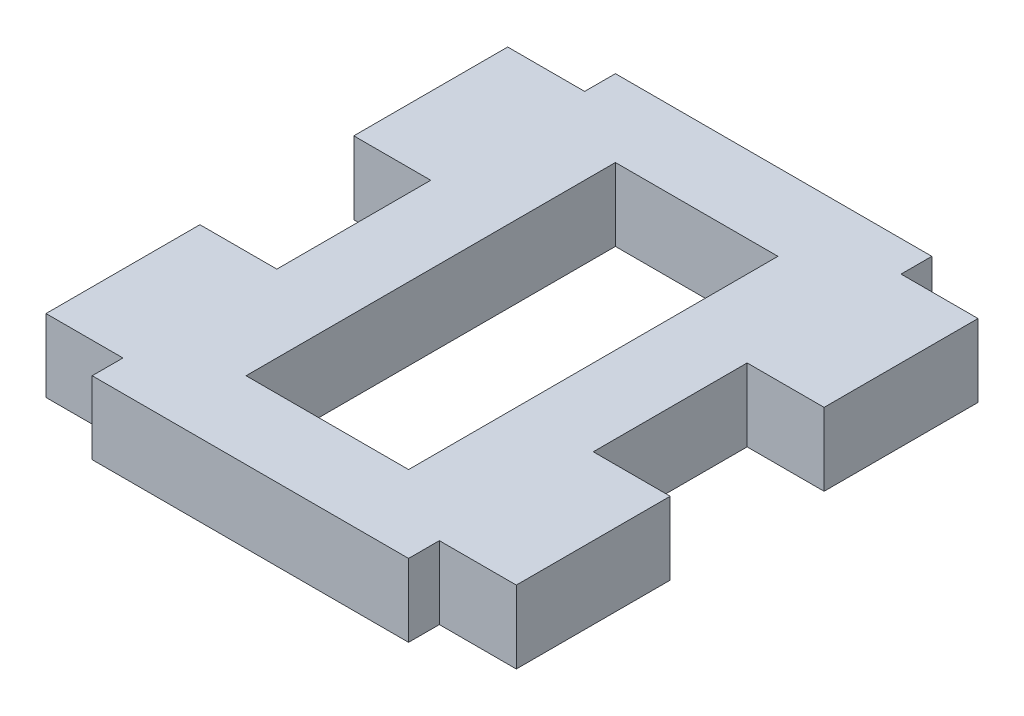
ISO-10303-21;
HEADER;
FILE_DESCRIPTION(('STEP AP214'),'2;1');
FILE_NAME('part.step','',(''),(''),'','','');
FILE_SCHEMA(('AUTOMOTIVE_DESIGN { 1 0 10303 214 1 1 1 1 }'));
ENDSEC;
DATA;
#1=APPLICATION_CONTEXT('core data for automotive mechanical design processes');
#2=APPLICATION_PROTOCOL_DEFINITION('international standard','automotive_design',2000,#1);
#3=PRODUCT_CONTEXT('',#1,'mechanical');
#4=PRODUCT('Part','Part','',(#3));
#5=PRODUCT_RELATED_PRODUCT_CATEGORY('part','',(#4));
#6=PRODUCT_DEFINITION_FORMATION('','',#4);
#7=PRODUCT_DEFINITION_CONTEXT('part definition',#1,'design');
#8=PRODUCT_DEFINITION('design','',#6,#7);
#9=PRODUCT_DEFINITION_SHAPE('','',#8);
#10=(LENGTH_UNIT() NAMED_UNIT(*) SI_UNIT(.MILLI.,.METRE.));
#11=(NAMED_UNIT(*) PLANE_ANGLE_UNIT() SI_UNIT($,.RADIAN.));
#12=(NAMED_UNIT(*) SI_UNIT($,.STERADIAN.) SOLID_ANGLE_UNIT());
#13=UNCERTAINTY_MEASURE_WITH_UNIT(LENGTH_MEASURE(1.E-05),#10,'distance_accuracy_value','');
#14=(GEOMETRIC_REPRESENTATION_CONTEXT(3) GLOBAL_UNCERTAINTY_ASSIGNED_CONTEXT((#13)) GLOBAL_UNIT_ASSIGNED_CONTEXT((#10,
#11,#12)) REPRESENTATION_CONTEXT('',''));
#15=CARTESIAN_POINT('',(0.,0.,0.));
#16=DIRECTION('',(0.,0.,1.));
#17=DIRECTION('',(1.,0.,0.));
#18=AXIS2_PLACEMENT_3D('',#15,#16,#17);
#19=CARTESIAN_POINT('',(13.0556,6.,21.59));
#20=DIRECTION('',(-1.,0.,0.));
#21=DIRECTION('',(0.,0.,1.));
#22=AXIS2_PLACEMENT_3D('',#19,#20,#21);
#23=PLANE('',#22);
#24=DIRECTION('',(0.,-1.,0.));
#25=VECTOR('',#24,1.);
#26=CARTESIAN_POINT('',(13.0556,20.1990316571237,-6.35));
#27=LINE('',#26,#25);
#28=CARTESIAN_POINT('',(13.0556,6.,-6.35));
#29=VERTEX_POINT('',#28);
#30=CARTESIAN_POINT('',(13.0556,0.,-6.35));
#31=VERTEX_POINT('',#30);
#32=EDGE_CURVE('E276',#29,#31,#27,.T.);
#33=ORIENTED_EDGE('',*,*,#32,.F.);
#34=DIRECTION('',(0.,0.,-1.));
#35=VECTOR('',#34,1.);
#36=CARTESIAN_POINT('',(13.0556,6.,21.59));
#37=LINE('',#36,#35);
#38=CARTESIAN_POINT('',(13.0556,6.,6.35));
#39=VERTEX_POINT('',#38);
#40=EDGE_CURVE('E341',#39,#29,#37,.T.);
#41=ORIENTED_EDGE('',*,*,#40,.F.);
#42=DIRECTION('',(0.,-1.,0.));
#43=VECTOR('',#42,1.);
#44=CARTESIAN_POINT('',(13.0556,20.1990316571237,6.35));
#45=LINE('',#44,#43);
#46=CARTESIAN_POINT('',(13.0556,0.,6.35));
#47=VERTEX_POINT('',#46);
#48=EDGE_CURVE('E249',#39,#47,#45,.T.);
#49=ORIENTED_EDGE('',*,*,#48,.T.);
#50=DIRECTION('',(0.,0.,-1.));
#51=VECTOR('',#50,1.);
#52=CARTESIAN_POINT('',(13.0556,0.,21.59));
#53=LINE('',#52,#51);
#54=EDGE_CURVE('E355',#47,#31,#53,.T.);
#55=ORIENTED_EDGE('',*,*,#54,.T.);
#56=EDGE_LOOP('',(#33,#41,#49,#55));
#57=FACE_BOUND('',#56,.T.);
#58=ADVANCED_FACE('F39',(#57),#23,.F.);
#59=DIRECTION('',(0.,-1.,0.));
#60=VECTOR('',#59,1.);
#61=CARTESIAN_POINT('',(13.0556,20.1990316571237,19.05));
#62=LINE('',#61,#60);
#63=CARTESIAN_POINT('',(13.0556,6.,19.05));
#64=VERTEX_POINT('',#63);
#65=CARTESIAN_POINT('',(13.0556,0.,19.05));
#66=VERTEX_POINT('',#65);
#67=EDGE_CURVE('E246',#64,#66,#62,.T.);
#68=ORIENTED_EDGE('',*,*,#67,.F.);
#69=CARTESIAN_POINT('',(13.0556,6.,21.59));
#70=VERTEX_POINT('',#69);
#71=EDGE_CURVE('E337',#70,#64,#37,.T.);
#72=ORIENTED_EDGE('',*,*,#71,.F.);
#73=DIRECTION('',(0.,-1.,0.));
#74=VECTOR('',#73,1.);
#75=CARTESIAN_POINT('',(13.0556,6.,21.59));
#76=LINE('',#75,#74);
#77=CARTESIAN_POINT('',(13.0556,0.,21.59));
#78=VERTEX_POINT('',#77);
#79=EDGE_CURVE('E351',#70,#78,#76,.T.);
#80=ORIENTED_EDGE('',*,*,#79,.T.);
#81=EDGE_CURVE('E352',#78,#66,#53,.T.);
#82=ORIENTED_EDGE('',*,*,#81,.T.);
#83=EDGE_LOOP('',(#68,#72,#80,#82));
#84=FACE_BOUND('',#83,.T.);
#85=ADVANCED_FACE('F423',(#84),#23,.F.);
#86=CARTESIAN_POINT('',(-13.0556,6.,21.59));
#87=DIRECTION('',(1.,0.,0.));
#88=DIRECTION('',(0.,0.,-1.));
#89=AXIS2_PLACEMENT_3D('',#86,#87,#88);
#90=PLANE('',#89);
#91=DIRECTION('',(0.,-1.,0.));
#92=VECTOR('',#91,1.);
#93=CARTESIAN_POINT('',(-13.0556,20.1990316571237,-19.05));
#94=LINE('',#93,#92);
#95=CARTESIAN_POINT('',(-13.0556,6.,-19.05));
#96=VERTEX_POINT('',#95);
#97=CARTESIAN_POINT('',(-13.0556,0.,-19.05));
#98=VERTEX_POINT('',#97);
#99=EDGE_CURVE('E296',#96,#98,#94,.T.);
#100=ORIENTED_EDGE('',*,*,#99,.F.);
#101=DIRECTION('',(0.,0.,1.));
#102=VECTOR('',#101,1.);
#103=CARTESIAN_POINT('',(-13.0556,6.,21.59));
#104=LINE('',#103,#102);
#105=CARTESIAN_POINT('',(-13.0556,6.,-21.59));
#106=VERTEX_POINT('',#105);
#107=EDGE_CURVE('E345',#106,#96,#104,.T.);
#108=ORIENTED_EDGE('',*,*,#107,.F.);
#109=DIRECTION('',(0.,-1.,0.));
#110=VECTOR('',#109,1.);
#111=CARTESIAN_POINT('',(-13.0556,6.,-21.59));
#112=LINE('',#111,#110);
#113=CARTESIAN_POINT('',(-13.0556,0.,-21.59));
#114=VERTEX_POINT('',#113);
#115=EDGE_CURVE('E47',#106,#114,#112,.T.);
#116=ORIENTED_EDGE('',*,*,#115,.T.);
#117=DIRECTION('',(0.,0.,1.));
#118=VECTOR('',#117,1.);
#119=CARTESIAN_POINT('',(-13.0556,0.,21.59));
#120=LINE('',#119,#118);
#121=EDGE_CURVE('E358',#114,#98,#120,.T.);
#122=ORIENTED_EDGE('',*,*,#121,.T.);
#123=EDGE_LOOP('',(#100,#108,#116,#122));
#124=FACE_BOUND('',#123,.T.);
#125=ADVANCED_FACE('F372',(#124),#90,.F.);
#126=CARTESIAN_POINT('',(-13.0556,6.,-6.35));
#127=VERTEX_POINT('',#126);
#128=CARTESIAN_POINT('',(-13.0556,6.,6.35));
#129=VERTEX_POINT('',#128);
#130=EDGE_CURVE('E349',#127,#129,#104,.T.);
#131=ORIENTED_EDGE('',*,*,#130,.F.);
#132=DIRECTION('',(0.,-1.,0.));
#133=VECTOR('',#132,1.);
#134=CARTESIAN_POINT('',(-13.0556,20.1990316571237,-6.35));
#135=LINE('',#134,#133);
#136=CARTESIAN_POINT('',(-13.0556,0.,-6.35));
#137=VERTEX_POINT('',#136);
#138=EDGE_CURVE('E299',#127,#137,#135,.T.);
#139=ORIENTED_EDGE('',*,*,#138,.T.);
#140=CARTESIAN_POINT('',(-13.0556,0.,6.35));
#141=VERTEX_POINT('',#140);
#142=EDGE_CURVE('E361',#137,#141,#120,.T.);
#143=ORIENTED_EDGE('',*,*,#142,.T.);
#144=DIRECTION('',(0.,-1.,0.));
#145=VECTOR('',#144,1.);
#146=CARTESIAN_POINT('',(-13.0556,20.1990316571237,6.35));
#147=LINE('',#146,#145);
#148=EDGE_CURVE('E315',#129,#141,#147,.T.);
#149=ORIENTED_EDGE('',*,*,#148,.F.);
#150=EDGE_LOOP('',(#131,#139,#143,#149));
#151=FACE_BOUND('',#150,.T.);
#152=ADVANCED_FACE('F450',(#151),#90,.F.);
#153=CARTESIAN_POINT('',(13.0556,6.,-19.05));
#154=VERTEX_POINT('',#153);
#155=CARTESIAN_POINT('',(13.0556,6.,-21.59));
#156=VERTEX_POINT('',#155);
#157=EDGE_CURVE('E342',#154,#156,#37,.T.);
#158=ORIENTED_EDGE('',*,*,#157,.F.);
#159=DIRECTION('',(0.,-1.,0.));
#160=VECTOR('',#159,1.);
#161=CARTESIAN_POINT('',(13.0556,20.1990316571237,-19.05));
#162=LINE('',#161,#160);
#163=CARTESIAN_POINT('',(13.0556,0.,-19.05));
#164=VERTEX_POINT('',#163);
#165=EDGE_CURVE('E269',#154,#164,#162,.T.);
#166=ORIENTED_EDGE('',*,*,#165,.T.);
#167=CARTESIAN_POINT('',(13.0556,0.,-21.59));
#168=VERTEX_POINT('',#167);
#169=EDGE_CURVE('E336',#164,#168,#53,.T.);
#170=ORIENTED_EDGE('',*,*,#169,.T.);
#171=DIRECTION('',(0.,-1.,0.));
#172=VECTOR('',#171,1.);
#173=CARTESIAN_POINT('',(13.0556,6.,-21.59));
#174=LINE('',#173,#172);
#175=EDGE_CURVE('E11',#156,#168,#174,.T.);
#176=ORIENTED_EDGE('',*,*,#175,.F.);
#177=EDGE_LOOP('',(#158,#166,#170,#176));
#178=FACE_BOUND('',#177,.T.);
#179=ADVANCED_FACE('F41',(#178),#23,.F.);
#180=CARTESIAN_POINT('',(-13.0556,6.,-21.59));
#181=DIRECTION('',(0.,0.,1.));
#182=DIRECTION('',(1.,0.,0.));
#183=AXIS2_PLACEMENT_3D('',#180,#181,#182);
#184=PLANE('',#183);
#185=DIRECTION('',(-1.,0.,0.));
#186=VECTOR('',#185,1.);
#187=CARTESIAN_POINT('',(-13.0556,0.,-21.59));
#188=LINE('',#187,#186);
#189=EDGE_CURVE('E354',#168,#114,#188,.T.);
#190=ORIENTED_EDGE('',*,*,#189,.T.);
#191=ORIENTED_EDGE('',*,*,#115,.F.);
#192=DIRECTION('',(-1.,0.,0.));
#193=VECTOR('',#192,1.);
#194=CARTESIAN_POINT('',(-13.0556,6.,-21.59));
#195=LINE('',#194,#193);
#196=EDGE_CURVE('E340',#156,#106,#195,.T.);
#197=ORIENTED_EDGE('',*,*,#196,.F.);
#198=ORIENTED_EDGE('',*,*,#175,.T.);
#199=EDGE_LOOP('',(#190,#191,#197,#198));
#200=FACE_BOUND('',#199,.T.);
#201=ADVANCED_FACE('F388',(#200),#184,.F.);
#202=CARTESIAN_POINT('',(-13.0556,6.,19.05));
#203=VERTEX_POINT('',#202);
#204=CARTESIAN_POINT('',(-13.0556,6.,21.59));
#205=VERTEX_POINT('',#204);
#206=EDGE_CURVE('E344',#203,#205,#104,.T.);
#207=ORIENTED_EDGE('',*,*,#206,.F.);
#208=DIRECTION('',(0.,-1.,0.));
#209=VECTOR('',#208,1.);
#210=CARTESIAN_POINT('',(-13.0556,20.1990316571237,19.05));
#211=LINE('',#210,#209);
#212=CARTESIAN_POINT('',(-13.0556,0.,19.05));
#213=VERTEX_POINT('',#212);
#214=EDGE_CURVE('E326',#203,#213,#211,.T.);
#215=ORIENTED_EDGE('',*,*,#214,.T.);
#216=CARTESIAN_POINT('',(-13.0556,0.,21.59));
#217=VERTEX_POINT('',#216);
#218=EDGE_CURVE('E357',#213,#217,#120,.T.);
#219=ORIENTED_EDGE('',*,*,#218,.T.);
#220=DIRECTION('',(0.,-1.,0.));
#221=VECTOR('',#220,1.);
#222=CARTESIAN_POINT('',(-13.0556,6.,21.59));
#223=LINE('',#222,#221);
#224=EDGE_CURVE('E365',#205,#217,#223,.T.);
#225=ORIENTED_EDGE('',*,*,#224,.F.);
#226=EDGE_LOOP('',(#207,#215,#219,#225));
#227=FACE_BOUND('',#226,.T.);
#228=ADVANCED_FACE('F479',(#227),#90,.F.);
#229=CARTESIAN_POINT('',(-13.0556,6.,21.59));
#230=DIRECTION('',(0.,0.,-1.));
#231=DIRECTION('',(-1.,0.,0.));
#232=AXIS2_PLACEMENT_3D('',#229,#230,#231);
#233=PLANE('',#232);
#234=DIRECTION('',(1.,0.,0.));
#235=VECTOR('',#234,1.);
#236=CARTESIAN_POINT('',(-13.0556,0.,21.59));
#237=LINE('',#236,#235);
#238=EDGE_CURVE('E360',#217,#78,#237,.T.);
#239=ORIENTED_EDGE('',*,*,#238,.T.);
#240=ORIENTED_EDGE('',*,*,#79,.F.);
#241=DIRECTION('',(1.,0.,0.));
#242=VECTOR('',#241,1.);
#243=CARTESIAN_POINT('',(-13.0556,6.,21.59));
#244=LINE('',#243,#242);
#245=EDGE_CURVE('E348',#205,#70,#244,.T.);
#246=ORIENTED_EDGE('',*,*,#245,.F.);
#247=ORIENTED_EDGE('',*,*,#224,.T.);
#248=EDGE_LOOP('',(#239,#240,#246,#247));
#249=FACE_BOUND('',#248,.T.);
#250=ADVANCED_FACE('F428',(#249),#233,.F.);
#251=CARTESIAN_POINT('',(0.,6.,0.));
#252=DIRECTION('',(0.,-1.,0.));
#253=DIRECTION('',(0.,0.,-1.));
#254=AXIS2_PLACEMENT_3D('',#251,#252,#253);
#255=PLANE('',#254);
#256=DIRECTION('',(1.,0.,0.));
#257=VECTOR('',#256,1.);
#258=CARTESIAN_POINT('',(-6.7056,6.,-15.24));
#259=LINE('',#258,#257);
#260=CARTESIAN_POINT('',(-6.7056,6.,-15.24));
#261=VERTEX_POINT('',#260);
#262=CARTESIAN_POINT('',(6.7056,6.,-15.24));
#263=VERTEX_POINT('',#262);
#264=EDGE_CURVE('E208',#261,#263,#259,.T.);
#265=ORIENTED_EDGE('',*,*,#264,.T.);
#266=DIRECTION('',(0.,0.,1.));
#267=VECTOR('',#266,1.);
#268=CARTESIAN_POINT('',(6.7056,6.,-15.24));
#269=LINE('',#268,#267);
#270=CARTESIAN_POINT('',(6.7056,6.,15.24));
#271=VERTEX_POINT('',#270);
#272=EDGE_CURVE('E202',#263,#271,#269,.T.);
#273=ORIENTED_EDGE('',*,*,#272,.T.);
#274=DIRECTION('',(-1.,0.,0.));
#275=VECTOR('',#274,1.);
#276=CARTESIAN_POINT('',(-6.7056,6.,15.24));
#277=LINE('',#276,#275);
#278=CARTESIAN_POINT('',(-6.7056,6.,15.24));
#279=VERTEX_POINT('',#278);
#280=EDGE_CURVE('E211',#271,#279,#277,.T.);
#281=ORIENTED_EDGE('',*,*,#280,.T.);
#282=DIRECTION('',(0.,0.,-1.));
#283=VECTOR('',#282,1.);
#284=CARTESIAN_POINT('',(-6.7056,6.,-15.24));
#285=LINE('',#284,#283);
#286=EDGE_CURVE('E54',#279,#261,#285,.T.);
#287=ORIENTED_EDGE('',*,*,#286,.T.);
#288=EDGE_LOOP('',(#265,#273,#281,#287));
#289=FACE_BOUND('',#288,.T.);
#290=ORIENTED_EDGE('',*,*,#71,.T.);
#291=DIRECTION('',(1.,0.,0.));
#292=VECTOR('',#291,1.);
#293=CARTESIAN_POINT('',(13.0556,6.,19.05));
#294=LINE('',#293,#292);
#295=CARTESIAN_POINT('',(19.4056,6.,19.05));
#296=VERTEX_POINT('',#295);
#297=EDGE_CURVE('E251',#64,#296,#294,.T.);
#298=ORIENTED_EDGE('',*,*,#297,.T.);
#299=DIRECTION('',(0.,0.,-1.));
#300=VECTOR('',#299,1.);
#301=CARTESIAN_POINT('',(19.4056,6.,19.05));
#302=LINE('',#301,#300);
#303=CARTESIAN_POINT('',(19.4056,6.,6.35));
#304=VERTEX_POINT('',#303);
#305=EDGE_CURVE('E237',#296,#304,#302,.T.);
#306=ORIENTED_EDGE('',*,*,#305,.T.);
#307=DIRECTION('',(-1.,0.,0.));
#308=VECTOR('',#307,1.);
#309=CARTESIAN_POINT('',(19.4056,6.,6.35));
#310=LINE('',#309,#308);
#311=EDGE_CURVE('E239',#304,#39,#310,.T.);
#312=ORIENTED_EDGE('',*,*,#311,.T.);
#313=ORIENTED_EDGE('',*,*,#40,.T.);
#314=DIRECTION('',(1.,0.,0.));
#315=VECTOR('',#314,1.);
#316=CARTESIAN_POINT('',(19.4056,6.,-6.35));
#317=LINE('',#316,#315);
#318=CARTESIAN_POINT('',(19.4056,6.,-6.35));
#319=VERTEX_POINT('',#318);
#320=EDGE_CURVE('E267',#29,#319,#317,.T.);
#321=ORIENTED_EDGE('',*,*,#320,.T.);
#322=DIRECTION('',(0.,0.,-1.));
#323=VECTOR('',#322,1.);
#324=CARTESIAN_POINT('',(19.4056,6.,-19.05));
#325=LINE('',#324,#323);
#326=CARTESIAN_POINT('',(19.4056,6.,-19.05));
#327=VERTEX_POINT('',#326);
#328=EDGE_CURVE('E279',#319,#327,#325,.T.);
#329=ORIENTED_EDGE('',*,*,#328,.T.);
#330=DIRECTION('',(-1.,0.,0.));
#331=VECTOR('',#330,1.);
#332=CARTESIAN_POINT('',(13.0556,6.,-19.05));
#333=LINE('',#332,#331);
#334=EDGE_CURVE('E264',#327,#154,#333,.T.);
#335=ORIENTED_EDGE('',*,*,#334,.T.);
#336=ORIENTED_EDGE('',*,*,#157,.T.);
#337=ORIENTED_EDGE('',*,*,#196,.T.);
#338=ORIENTED_EDGE('',*,*,#107,.T.);
#339=DIRECTION('',(-1.,0.,0.));
#340=VECTOR('',#339,1.);
#341=CARTESIAN_POINT('',(-13.0556,6.,-19.05));
#342=LINE('',#341,#340);
#343=CARTESIAN_POINT('',(-19.4056,6.,-19.05));
#344=VERTEX_POINT('',#343);
#345=EDGE_CURVE('E301',#96,#344,#342,.T.);
#346=ORIENTED_EDGE('',*,*,#345,.T.);
#347=DIRECTION('',(0.,0.,1.));
#348=VECTOR('',#347,1.);
#349=CARTESIAN_POINT('',(-19.4056,6.,-19.05));
#350=LINE('',#349,#348);
#351=CARTESIAN_POINT('',(-19.4056,6.,-6.35));
#352=VERTEX_POINT('',#351);
#353=EDGE_CURVE('E233',#344,#352,#350,.T.);
#354=ORIENTED_EDGE('',*,*,#353,.T.);
#355=DIRECTION('',(1.,0.,0.));
#356=VECTOR('',#355,1.);
#357=CARTESIAN_POINT('',(-19.4056,6.,-6.35));
#358=LINE('',#357,#356);
#359=EDGE_CURVE('E290',#352,#127,#358,.T.);
#360=ORIENTED_EDGE('',*,*,#359,.T.);
#361=ORIENTED_EDGE('',*,*,#130,.T.);
#362=DIRECTION('',(-1.,0.,0.));
#363=VECTOR('',#362,1.);
#364=CARTESIAN_POINT('',(-19.4056,6.,6.35));
#365=LINE('',#364,#363);
#366=CARTESIAN_POINT('',(-19.4056,6.,6.35));
#367=VERTEX_POINT('',#366);
#368=EDGE_CURVE('E314',#129,#367,#365,.T.);
#369=ORIENTED_EDGE('',*,*,#368,.T.);
#370=DIRECTION('',(0.,0.,1.));
#371=VECTOR('',#370,1.);
#372=CARTESIAN_POINT('',(-19.4056,6.,19.05));
#373=LINE('',#372,#371);
#374=CARTESIAN_POINT('',(-19.4056,6.,19.05));
#375=VERTEX_POINT('',#374);
#376=EDGE_CURVE('E312',#367,#375,#373,.T.);
#377=ORIENTED_EDGE('',*,*,#376,.T.);
#378=DIRECTION('',(1.,0.,0.));
#379=VECTOR('',#378,1.);
#380=CARTESIAN_POINT('',(-13.0556,6.,19.05));
#381=LINE('',#380,#379);
#382=EDGE_CURVE('E317',#375,#203,#381,.T.);
#383=ORIENTED_EDGE('',*,*,#382,.T.);
#384=ORIENTED_EDGE('',*,*,#206,.T.);
#385=ORIENTED_EDGE('',*,*,#245,.T.);
#386=EDGE_LOOP('',(#290,#298,#306,#312,#313,#321,#329,#335,#336,#337,#338,#346,#354,#360,#361,
#369,#377,#383,#384,#385));
#387=FACE_BOUND('',#386,.T.);
#388=ADVANCED_FACE('F215',(#289,#387),#255,.F.);
#389=CARTESIAN_POINT('',(0.,0.,0.));
#390=DIRECTION('',(0.,-1.,0.));
#391=DIRECTION('',(0.,0.,-1.));
#392=AXIS2_PLACEMENT_3D('',#389,#390,#391);
#393=PLANE('',#392);
#394=DIRECTION('',(0.,0.,1.));
#395=VECTOR('',#394,1.);
#396=CARTESIAN_POINT('',(6.7056,0.,-15.24));
#397=LINE('',#396,#395);
#398=CARTESIAN_POINT('',(6.7056,0.,-15.24));
#399=VERTEX_POINT('',#398);
#400=CARTESIAN_POINT('',(6.7056,0.,15.24));
#401=VERTEX_POINT('',#400);
#402=EDGE_CURVE('E62',#399,#401,#397,.T.);
#403=ORIENTED_EDGE('',*,*,#402,.F.);
#404=DIRECTION('',(1.,0.,0.));
#405=VECTOR('',#404,1.);
#406=CARTESIAN_POINT('',(-6.7056,0.,-15.24));
#407=LINE('',#406,#405);
#408=CARTESIAN_POINT('',(-6.7056,0.,-15.24));
#409=VERTEX_POINT('',#408);
#410=EDGE_CURVE('E218',#409,#399,#407,.T.);
#411=ORIENTED_EDGE('',*,*,#410,.F.);
#412=DIRECTION('',(0.,0.,-1.));
#413=VECTOR('',#412,1.);
#414=CARTESIAN_POINT('',(-6.7056,0.,-15.24));
#415=LINE('',#414,#413);
#416=CARTESIAN_POINT('',(-6.7056,0.,15.24));
#417=VERTEX_POINT('',#416);
#418=EDGE_CURVE('E221',#417,#409,#415,.T.);
#419=ORIENTED_EDGE('',*,*,#418,.F.);
#420=DIRECTION('',(-1.,0.,0.));
#421=VECTOR('',#420,1.);
#422=CARTESIAN_POINT('',(-6.7056,0.,15.24));
#423=LINE('',#422,#421);
#424=EDGE_CURVE('E227',#401,#417,#423,.T.);
#425=ORIENTED_EDGE('',*,*,#424,.F.);
#426=EDGE_LOOP('',(#403,#411,#419,#425));
#427=FACE_BOUND('',#426,.T.);
#428=ORIENTED_EDGE('',*,*,#81,.F.);
#429=ORIENTED_EDGE('',*,*,#238,.F.);
#430=ORIENTED_EDGE('',*,*,#218,.F.);
#431=DIRECTION('',(-1.,0.,0.));
#432=VECTOR('',#431,1.);
#433=CARTESIAN_POINT('',(-13.0556,0.,19.05));
#434=LINE('',#433,#432);
#435=CARTESIAN_POINT('',(-19.4056,0.,19.05));
#436=VERTEX_POINT('',#435);
#437=EDGE_CURVE('E260',#213,#436,#434,.T.);
#438=ORIENTED_EDGE('',*,*,#437,.T.);
#439=DIRECTION('',(0.,0.,-1.));
#440=VECTOR('',#439,1.);
#441=CARTESIAN_POINT('',(-19.4056,0.,19.05));
#442=LINE('',#441,#440);
#443=CARTESIAN_POINT('',(-19.4056,0.,6.35));
#444=VERTEX_POINT('',#443);
#445=EDGE_CURVE('E320',#436,#444,#442,.T.);
#446=ORIENTED_EDGE('',*,*,#445,.T.);
#447=DIRECTION('',(1.,0.,0.));
#448=VECTOR('',#447,1.);
#449=CARTESIAN_POINT('',(-19.4056,0.,6.35));
#450=LINE('',#449,#448);
#451=EDGE_CURVE('E323',#444,#141,#450,.T.);
#452=ORIENTED_EDGE('',*,*,#451,.T.);
#453=ORIENTED_EDGE('',*,*,#142,.F.);
#454=DIRECTION('',(-1.,0.,0.));
#455=VECTOR('',#454,1.);
#456=CARTESIAN_POINT('',(-19.4056,0.,-6.35));
#457=LINE('',#456,#455);
#458=CARTESIAN_POINT('',(-19.4056,0.,-6.35));
#459=VERTEX_POINT('',#458);
#460=EDGE_CURVE('E268',#137,#459,#457,.T.);
#461=ORIENTED_EDGE('',*,*,#460,.T.);
#462=DIRECTION('',(0.,0.,-1.));
#463=VECTOR('',#462,1.);
#464=CARTESIAN_POINT('',(-19.4056,0.,-19.05));
#465=LINE('',#464,#463);
#466=CARTESIAN_POINT('',(-19.4056,0.,-19.05));
#467=VERTEX_POINT('',#466);
#468=EDGE_CURVE('E304',#459,#467,#465,.T.);
#469=ORIENTED_EDGE('',*,*,#468,.T.);
#470=DIRECTION('',(1.,0.,0.));
#471=VECTOR('',#470,1.);
#472=CARTESIAN_POINT('',(-13.0556,0.,-19.05));
#473=LINE('',#472,#471);
#474=EDGE_CURVE('E293',#467,#98,#473,.T.);
#475=ORIENTED_EDGE('',*,*,#474,.T.);
#476=ORIENTED_EDGE('',*,*,#121,.F.);
#477=ORIENTED_EDGE('',*,*,#189,.F.);
#478=ORIENTED_EDGE('',*,*,#169,.F.);
#479=DIRECTION('',(1.,0.,0.));
#480=VECTOR('',#479,1.);
#481=CARTESIAN_POINT('',(13.0556,0.,-19.05));
#482=LINE('',#481,#480);
#483=CARTESIAN_POINT('',(19.4056,0.,-19.05));
#484=VERTEX_POINT('',#483);
#485=EDGE_CURVE('E240',#164,#484,#482,.T.);
#486=ORIENTED_EDGE('',*,*,#485,.T.);
#487=DIRECTION('',(0.,0.,1.));
#488=VECTOR('',#487,1.);
#489=CARTESIAN_POINT('',(19.4056,0.,-19.05));
#490=LINE('',#489,#488);
#491=CARTESIAN_POINT('',(19.4056,0.,-6.35));
#492=VERTEX_POINT('',#491);
#493=EDGE_CURVE('E282',#484,#492,#490,.T.);
#494=ORIENTED_EDGE('',*,*,#493,.T.);
#495=DIRECTION('',(-1.,0.,0.));
#496=VECTOR('',#495,1.);
#497=CARTESIAN_POINT('',(19.4056,0.,-6.35));
#498=LINE('',#497,#496);
#499=EDGE_CURVE('E271',#492,#31,#498,.T.);
#500=ORIENTED_EDGE('',*,*,#499,.T.);
#501=ORIENTED_EDGE('',*,*,#54,.F.);
#502=DIRECTION('',(1.,0.,0.));
#503=VECTOR('',#502,1.);
#504=CARTESIAN_POINT('',(19.4056,0.,6.35));
#505=LINE('',#504,#503);
#506=CARTESIAN_POINT('',(19.4056,0.,6.35));
#507=VERTEX_POINT('',#506);
#508=EDGE_CURVE('E257',#47,#507,#505,.T.);
#509=ORIENTED_EDGE('',*,*,#508,.T.);
#510=DIRECTION('',(0.,0.,1.));
#511=VECTOR('',#510,1.);
#512=CARTESIAN_POINT('',(19.4056,0.,19.05));
#513=LINE('',#512,#511);
#514=CARTESIAN_POINT('',(19.4056,0.,19.05));
#515=VERTEX_POINT('',#514);
#516=EDGE_CURVE('E254',#507,#515,#513,.T.);
#517=ORIENTED_EDGE('',*,*,#516,.T.);
#518=DIRECTION('',(-1.,0.,0.));
#519=VECTOR('',#518,1.);
#520=CARTESIAN_POINT('',(13.0556,0.,19.05));
#521=LINE('',#520,#519);
#522=EDGE_CURVE('E243',#515,#66,#521,.T.);
#523=ORIENTED_EDGE('',*,*,#522,.T.);
#524=EDGE_LOOP('',(#428,#429,#430,#438,#446,#452,#453,#461,#469,#475,#476,#477,#478,#486,#494,
#500,#501,#509,#517,#523));
#525=FACE_BOUND('',#524,.T.);
#526=ADVANCED_FACE('F378',(#427,#525),#393,.T.);
#527=CARTESIAN_POINT('',(-19.4056,20.1990316571237,6.35));
#528=DIRECTION('',(0.,0.,-1.));
#529=DIRECTION('',(-1.,0.,0.));
#530=AXIS2_PLACEMENT_3D('',#527,#528,#529);
#531=PLANE('',#530);
#532=ORIENTED_EDGE('',*,*,#368,.F.);
#533=ORIENTED_EDGE('',*,*,#148,.T.);
#534=ORIENTED_EDGE('',*,*,#451,.F.);
#535=DIRECTION('',(0.,-1.,0.));
#536=VECTOR('',#535,1.);
#537=CARTESIAN_POINT('',(-19.4056,20.1990316571237,6.35));
#538=LINE('',#537,#536);
#539=EDGE_CURVE('E329',#367,#444,#538,.T.);
#540=ORIENTED_EDGE('',*,*,#539,.F.);
#541=EDGE_LOOP('',(#532,#533,#534,#540));
#542=FACE_BOUND('',#541,.T.);
#543=ADVANCED_FACE('F447',(#542),#531,.T.);
#544=CARTESIAN_POINT('',(-19.4056,20.1990316571237,19.05));
#545=DIRECTION('',(-1.,0.,0.));
#546=DIRECTION('',(0.,0.,1.));
#547=AXIS2_PLACEMENT_3D('',#544,#545,#546);
#548=PLANE('',#547);
#549=ORIENTED_EDGE('',*,*,#376,.F.);
#550=ORIENTED_EDGE('',*,*,#539,.T.);
#551=ORIENTED_EDGE('',*,*,#445,.F.);
#552=DIRECTION('',(0.,-1.,0.));
#553=VECTOR('',#552,1.);
#554=CARTESIAN_POINT('',(-19.4056,20.1990316571237,19.05));
#555=LINE('',#554,#553);
#556=EDGE_CURVE('E331',#375,#436,#555,.T.);
#557=ORIENTED_EDGE('',*,*,#556,.F.);
#558=EDGE_LOOP('',(#549,#550,#551,#557));
#559=FACE_BOUND('',#558,.T.);
#560=ADVANCED_FACE('F441',(#559),#548,.T.);
#561=CARTESIAN_POINT('',(-13.0556,20.1990316571237,19.05));
#562=DIRECTION('',(0.,0.,1.));
#563=DIRECTION('',(1.,0.,0.));
#564=AXIS2_PLACEMENT_3D('',#561,#562,#563);
#565=PLANE('',#564);
#566=ORIENTED_EDGE('',*,*,#382,.F.);
#567=ORIENTED_EDGE('',*,*,#556,.T.);
#568=ORIENTED_EDGE('',*,*,#437,.F.);
#569=ORIENTED_EDGE('',*,*,#214,.F.);
#570=EDGE_LOOP('',(#566,#567,#568,#569));
#571=FACE_BOUND('',#570,.T.);
#572=ADVANCED_FACE('F436',(#571),#565,.T.);
#573=CARTESIAN_POINT('',(-19.4056,20.1990316571237,-6.35));
#574=DIRECTION('',(0.,0.,1.));
#575=DIRECTION('',(1.,0.,0.));
#576=AXIS2_PLACEMENT_3D('',#573,#574,#575);
#577=PLANE('',#576);
#578=ORIENTED_EDGE('',*,*,#359,.F.);
#579=DIRECTION('',(0.,-1.,0.));
#580=VECTOR('',#579,1.);
#581=CARTESIAN_POINT('',(-19.4056,20.1990316571237,-6.35));
#582=LINE('',#581,#580);
#583=EDGE_CURVE('E291',#352,#459,#582,.T.);
#584=ORIENTED_EDGE('',*,*,#583,.T.);
#585=ORIENTED_EDGE('',*,*,#460,.F.);
#586=ORIENTED_EDGE('',*,*,#138,.F.);
#587=EDGE_LOOP('',(#578,#584,#585,#586));
#588=FACE_BOUND('',#587,.T.);
#589=ADVANCED_FACE('F456',(#588),#577,.T.);
#590=CARTESIAN_POINT('',(-13.0556,20.1990316571237,-19.05));
#591=DIRECTION('',(0.,0.,-1.));
#592=DIRECTION('',(-1.,0.,0.));
#593=AXIS2_PLACEMENT_3D('',#590,#591,#592);
#594=PLANE('',#593);
#595=ORIENTED_EDGE('',*,*,#345,.F.);
#596=ORIENTED_EDGE('',*,*,#99,.T.);
#597=ORIENTED_EDGE('',*,*,#474,.F.);
#598=DIRECTION('',(0.,-1.,0.));
#599=VECTOR('',#598,1.);
#600=CARTESIAN_POINT('',(-19.4056,20.1990316571237,-19.05));
#601=LINE('',#600,#599);
#602=EDGE_CURVE('E294',#344,#467,#601,.T.);
#603=ORIENTED_EDGE('',*,*,#602,.F.);
#604=EDGE_LOOP('',(#595,#596,#597,#603));
#605=FACE_BOUND('',#604,.T.);
#606=ADVANCED_FACE('F385',(#605),#594,.T.);
#607=CARTESIAN_POINT('',(-19.4056,20.1990316571237,-19.05));
#608=DIRECTION('',(-1.,0.,0.));
#609=DIRECTION('',(0.,0.,1.));
#610=AXIS2_PLACEMENT_3D('',#607,#608,#609);
#611=PLANE('',#610);
#612=ORIENTED_EDGE('',*,*,#353,.F.);
#613=ORIENTED_EDGE('',*,*,#602,.T.);
#614=ORIENTED_EDGE('',*,*,#468,.F.);
#615=ORIENTED_EDGE('',*,*,#583,.F.);
#616=EDGE_LOOP('',(#612,#613,#614,#615));
#617=FACE_BOUND('',#616,.T.);
#618=ADVANCED_FACE('F458',(#617),#611,.T.);
#619=CARTESIAN_POINT('',(19.4056,20.1990316571237,6.35));
#620=DIRECTION('',(0.,0.,-1.));
#621=DIRECTION('',(-1.,0.,0.));
#622=AXIS2_PLACEMENT_3D('',#619,#620,#621);
#623=PLANE('',#622);
#624=ORIENTED_EDGE('',*,*,#311,.F.);
#625=DIRECTION('',(0.,-1.,0.));
#626=VECTOR('',#625,1.);
#627=CARTESIAN_POINT('',(19.4056,20.1990316571237,6.35));
#628=LINE('',#627,#626);
#629=EDGE_CURVE('E241',#304,#507,#628,.T.);
#630=ORIENTED_EDGE('',*,*,#629,.T.);
#631=ORIENTED_EDGE('',*,*,#508,.F.);
#632=ORIENTED_EDGE('',*,*,#48,.F.);
#633=EDGE_LOOP('',(#624,#630,#631,#632));
#634=FACE_BOUND('',#633,.T.);
#635=ADVANCED_FACE('F412',(#634),#623,.T.);
#636=CARTESIAN_POINT('',(13.0556,20.1990316571237,19.05));
#637=DIRECTION('',(0.,0.,1.));
#638=DIRECTION('',(1.,0.,0.));
#639=AXIS2_PLACEMENT_3D('',#636,#637,#638);
#640=PLANE('',#639);
#641=ORIENTED_EDGE('',*,*,#297,.F.);
#642=ORIENTED_EDGE('',*,*,#67,.T.);
#643=ORIENTED_EDGE('',*,*,#522,.F.);
#644=DIRECTION('',(0.,-1.,0.));
#645=VECTOR('',#644,1.);
#646=CARTESIAN_POINT('',(19.4056,20.1990316571237,19.05));
#647=LINE('',#646,#645);
#648=EDGE_CURVE('E244',#296,#515,#647,.T.);
#649=ORIENTED_EDGE('',*,*,#648,.F.);
#650=EDGE_LOOP('',(#641,#642,#643,#649));
#651=FACE_BOUND('',#650,.T.);
#652=ADVANCED_FACE('F420',(#651),#640,.T.);
#653=CARTESIAN_POINT('',(19.4056,20.1990316571237,19.05));
#654=DIRECTION('',(1.,0.,0.));
#655=DIRECTION('',(0.,0.,-1.));
#656=AXIS2_PLACEMENT_3D('',#653,#654,#655);
#657=PLANE('',#656);
#658=ORIENTED_EDGE('',*,*,#305,.F.);
#659=ORIENTED_EDGE('',*,*,#648,.T.);
#660=ORIENTED_EDGE('',*,*,#516,.F.);
#661=ORIENTED_EDGE('',*,*,#629,.F.);
#662=EDGE_LOOP('',(#658,#659,#660,#661));
#663=FACE_BOUND('',#662,.T.);
#664=ADVANCED_FACE('F416',(#663),#657,.T.);
#665=CARTESIAN_POINT('',(19.4056,20.1990316571237,-6.35));
#666=DIRECTION('',(0.,0.,1.));
#667=DIRECTION('',(1.,0.,0.));
#668=AXIS2_PLACEMENT_3D('',#665,#666,#667);
#669=PLANE('',#668);
#670=ORIENTED_EDGE('',*,*,#320,.F.);
#671=ORIENTED_EDGE('',*,*,#32,.T.);
#672=ORIENTED_EDGE('',*,*,#499,.F.);
#673=DIRECTION('',(0.,-1.,0.));
#674=VECTOR('',#673,1.);
#675=CARTESIAN_POINT('',(19.4056,20.1990316571237,-6.35));
#676=LINE('',#675,#674);
#677=EDGE_CURVE('E274',#319,#492,#676,.T.);
#678=ORIENTED_EDGE('',*,*,#677,.F.);
#679=EDGE_LOOP('',(#670,#671,#672,#678));
#680=FACE_BOUND('',#679,.T.);
#681=ADVANCED_FACE('F400',(#680),#669,.T.);
#682=CARTESIAN_POINT('',(19.4056,20.1990316571237,-19.05));
#683=DIRECTION('',(1.,0.,0.));
#684=DIRECTION('',(0.,0.,-1.));
#685=AXIS2_PLACEMENT_3D('',#682,#683,#684);
#686=PLANE('',#685);
#687=ORIENTED_EDGE('',*,*,#328,.F.);
#688=ORIENTED_EDGE('',*,*,#677,.T.);
#689=ORIENTED_EDGE('',*,*,#493,.F.);
#690=DIRECTION('',(0.,-1.,0.));
#691=VECTOR('',#690,1.);
#692=CARTESIAN_POINT('',(19.4056,20.1990316571237,-19.05));
#693=LINE('',#692,#691);
#694=EDGE_CURVE('E272',#327,#484,#693,.T.);
#695=ORIENTED_EDGE('',*,*,#694,.F.);
#696=EDGE_LOOP('',(#687,#688,#689,#695));
#697=FACE_BOUND('',#696,.T.);
#698=ADVANCED_FACE('F406',(#697),#686,.T.);
#699=CARTESIAN_POINT('',(13.0556,20.1990316571237,-19.05));
#700=DIRECTION('',(0.,0.,-1.));
#701=DIRECTION('',(-1.,0.,0.));
#702=AXIS2_PLACEMENT_3D('',#699,#700,#701);
#703=PLANE('',#702);
#704=ORIENTED_EDGE('',*,*,#334,.F.);
#705=ORIENTED_EDGE('',*,*,#694,.T.);
#706=ORIENTED_EDGE('',*,*,#485,.F.);
#707=ORIENTED_EDGE('',*,*,#165,.F.);
#708=EDGE_LOOP('',(#704,#705,#706,#707));
#709=FACE_BOUND('',#708,.T.);
#710=ADVANCED_FACE('F568',(#709),#703,.T.);
#711=CARTESIAN_POINT('',(6.7056,6.,-15.24));
#712=DIRECTION('',(1.,0.,0.));
#713=DIRECTION('',(0.,0.,-1.));
#714=AXIS2_PLACEMENT_3D('',#711,#712,#713);
#715=PLANE('',#714);
#716=ORIENTED_EDGE('',*,*,#402,.T.);
#717=DIRECTION('',(0.,-1.,0.));
#718=VECTOR('',#717,1.);
#719=CARTESIAN_POINT('',(6.7056,6.,15.24));
#720=LINE('',#719,#718);
#721=EDGE_CURVE('E198',#271,#401,#720,.T.);
#722=ORIENTED_EDGE('',*,*,#721,.F.);
#723=ORIENTED_EDGE('',*,*,#272,.F.);
#724=DIRECTION('',(0.,-1.,0.));
#725=VECTOR('',#724,1.);
#726=CARTESIAN_POINT('',(6.7056,6.,-15.24));
#727=LINE('',#726,#725);
#728=EDGE_CURVE('E231',#263,#399,#727,.T.);
#729=ORIENTED_EDGE('',*,*,#728,.T.);
#730=EDGE_LOOP('',(#716,#722,#723,#729));
#731=FACE_BOUND('',#730,.T.);
#732=ADVANCED_FACE('F200',(#731),#715,.F.);
#733=CARTESIAN_POINT('',(-6.7056,6.,-15.24));
#734=DIRECTION('',(0.,0.,-1.));
#735=DIRECTION('',(-1.,0.,0.));
#736=AXIS2_PLACEMENT_3D('',#733,#734,#735);
#737=PLANE('',#736);
#738=ORIENTED_EDGE('',*,*,#410,.T.);
#739=ORIENTED_EDGE('',*,*,#728,.F.);
#740=ORIENTED_EDGE('',*,*,#264,.F.);
#741=DIRECTION('',(0.,-1.,0.));
#742=VECTOR('',#741,1.);
#743=CARTESIAN_POINT('',(-6.7056,6.,-15.24));
#744=LINE('',#743,#742);
#745=EDGE_CURVE('E234',#261,#409,#744,.T.);
#746=ORIENTED_EDGE('',*,*,#745,.T.);
#747=EDGE_LOOP('',(#738,#739,#740,#746));
#748=FACE_BOUND('',#747,.T.);
#749=ADVANCED_FACE('F586',(#748),#737,.F.);
#750=CARTESIAN_POINT('',(-6.7056,6.,-15.24));
#751=DIRECTION('',(-1.,0.,0.));
#752=DIRECTION('',(0.,0.,1.));
#753=AXIS2_PLACEMENT_3D('',#750,#751,#752);
#754=PLANE('',#753);
#755=ORIENTED_EDGE('',*,*,#418,.T.);
#756=ORIENTED_EDGE('',*,*,#745,.F.);
#757=ORIENTED_EDGE('',*,*,#286,.F.);
#758=DIRECTION('',(0.,-1.,0.));
#759=VECTOR('',#758,1.);
#760=CARTESIAN_POINT('',(-6.7056,6.,15.24));
#761=LINE('',#760,#759);
#762=EDGE_CURVE('E207',#279,#417,#761,.T.);
#763=ORIENTED_EDGE('',*,*,#762,.T.);
#764=EDGE_LOOP('',(#755,#756,#757,#763));
#765=FACE_BOUND('',#764,.T.);
#766=ADVANCED_FACE('F595',(#765),#754,.F.);
#767=CARTESIAN_POINT('',(-6.7056,6.,15.24));
#768=DIRECTION('',(0.,0.,1.));
#769=DIRECTION('',(1.,0.,0.));
#770=AXIS2_PLACEMENT_3D('',#767,#768,#769);
#771=PLANE('',#770);
#772=ORIENTED_EDGE('',*,*,#424,.T.);
#773=ORIENTED_EDGE('',*,*,#762,.F.);
#774=ORIENTED_EDGE('',*,*,#280,.F.);
#775=ORIENTED_EDGE('',*,*,#721,.T.);
#776=EDGE_LOOP('',(#772,#773,#774,#775));
#777=FACE_BOUND('',#776,.T.);
#778=ADVANCED_FACE('F212',(#777),#771,.F.);
#779=CLOSED_SHELL('',(#58,#85,#125,#152,#179,#201,#228,#250,#388,#526,#543,#560,#572,#589,#606,
#618,#635,#652,#664,#681,#698,#710,#732,#749,#766,#778));
#780=MANIFOLD_SOLID_BREP('B2',#779);
#781=ADVANCED_BREP_SHAPE_REPRESENTATION('',(#18,#780),#14);
#782=SHAPE_DEFINITION_REPRESENTATION(#9,#781);
ENDSEC;
END-ISO-10303-21;
